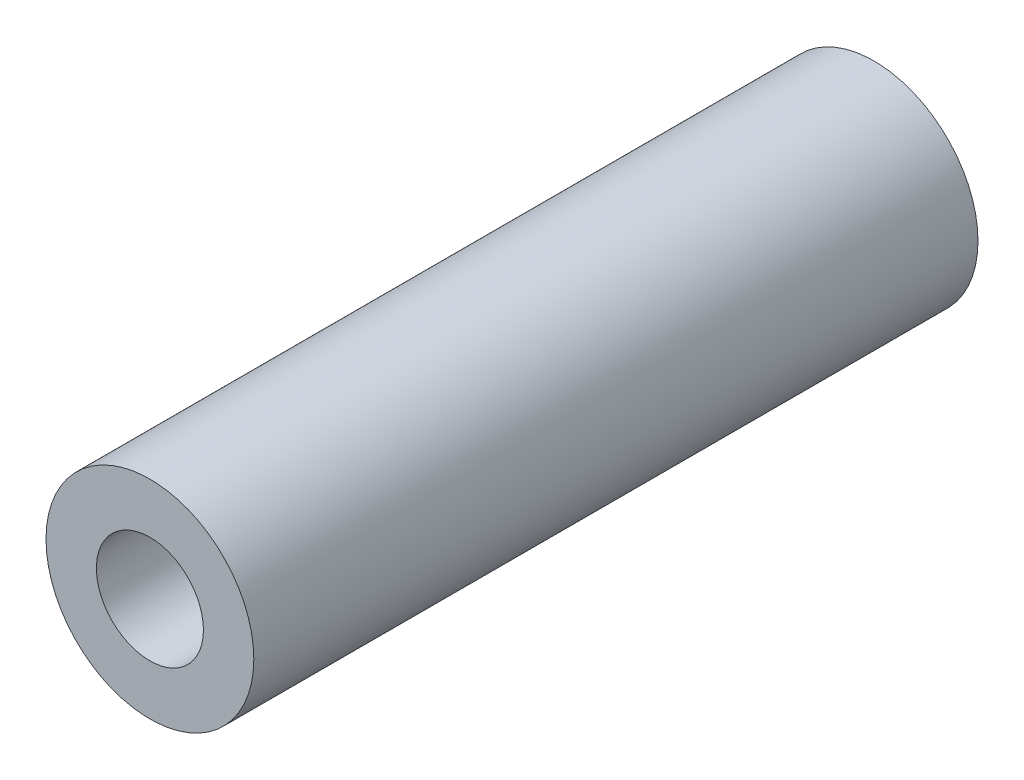
ISO-10303-21;
HEADER;
FILE_DESCRIPTION(('STEP AP214'),'2;1');
FILE_NAME('part.step','',(''),(''),'','','');
FILE_SCHEMA(('AUTOMOTIVE_DESIGN { 1 0 10303 214 1 1 1 1 }'));
ENDSEC;
DATA;
#1=APPLICATION_CONTEXT('core data for automotive mechanical design processes');
#2=APPLICATION_PROTOCOL_DEFINITION('international standard','automotive_design',2000,#1);
#3=PRODUCT_CONTEXT('',#1,'mechanical');
#4=PRODUCT('Part','Part','',(#3));
#5=PRODUCT_RELATED_PRODUCT_CATEGORY('part','',(#4));
#6=PRODUCT_DEFINITION_FORMATION('','',#4);
#7=PRODUCT_DEFINITION_CONTEXT('part definition',#1,'design');
#8=PRODUCT_DEFINITION('design','',#6,#7);
#9=PRODUCT_DEFINITION_SHAPE('','',#8);
#10=(LENGTH_UNIT() NAMED_UNIT(*) SI_UNIT(.MILLI.,.METRE.));
#11=(NAMED_UNIT(*) PLANE_ANGLE_UNIT() SI_UNIT($,.RADIAN.));
#12=(NAMED_UNIT(*) SI_UNIT($,.STERADIAN.) SOLID_ANGLE_UNIT());
#13=UNCERTAINTY_MEASURE_WITH_UNIT(LENGTH_MEASURE(1.E-05),#10,'distance_accuracy_value','');
#14=(GEOMETRIC_REPRESENTATION_CONTEXT(3) GLOBAL_UNCERTAINTY_ASSIGNED_CONTEXT((#13)) GLOBAL_UNIT_ASSIGNED_CONTEXT((#10,
#11,#12)) REPRESENTATION_CONTEXT('',''));
#15=CARTESIAN_POINT('',(0.,0.,0.));
#16=DIRECTION('',(0.,0.,1.));
#17=DIRECTION('',(1.,0.,0.));
#18=AXIS2_PLACEMENT_3D('',#15,#16,#17);
#19=CARTESIAN_POINT('',(0.,0.,23.));
#20=DIRECTION('',(0.,0.,1.));
#21=DIRECTION('',(1.,0.,0.));
#22=AXIS2_PLACEMENT_3D('',#19,#20,#21);
#23=PLANE('',#22);
#24=CARTESIAN_POINT('',(0.,0.,23.));
#25=DIRECTION('',(0.,0.,1.));
#26=DIRECTION('',(1.,0.,0.));
#27=AXIS2_PLACEMENT_3D('',#24,#25,#26);
#28=CIRCLE('',#27,3.3);
#29=CARTESIAN_POINT('',(3.3,0.,23.));
#30=VERTEX_POINT('',#29);
#31=EDGE_CURVE('E10',#30,#30,#28,.T.);
#32=ORIENTED_EDGE('',*,*,#31,.T.);
#33=EDGE_LOOP('',(#32));
#34=FACE_BOUND('',#33,.T.);
#35=CARTESIAN_POINT('',(0.,0.,23.));
#36=DIRECTION('',(0.,0.,1.));
#37=DIRECTION('',(1.,0.,0.));
#38=AXIS2_PLACEMENT_3D('',#35,#36,#37);
#39=CIRCLE('',#38,1.7);
#40=CARTESIAN_POINT('',(1.7,0.,23.));
#41=VERTEX_POINT('',#40);
#42=EDGE_CURVE('E46',#41,#41,#39,.T.);
#43=ORIENTED_EDGE('',*,*,#42,.F.);
#44=EDGE_LOOP('',(#43));
#45=FACE_BOUND('',#44,.T.);
#46=ADVANCED_FACE('F35',(#34,#45),#23,.T.);
#47=CARTESIAN_POINT('',(0.,0.,0.));
#48=DIRECTION('',(0.,0.,1.));
#49=DIRECTION('',(1.,0.,0.));
#50=AXIS2_PLACEMENT_3D('',#47,#48,#49);
#51=PLANE('',#50);
#52=CARTESIAN_POINT('',(0.,0.,0.));
#53=DIRECTION('',(0.,0.,1.));
#54=DIRECTION('',(1.,0.,0.));
#55=AXIS2_PLACEMENT_3D('',#52,#53,#54);
#56=CIRCLE('',#55,3.3);
#57=CARTESIAN_POINT('',(3.3,0.,0.));
#58=VERTEX_POINT('',#57);
#59=EDGE_CURVE('E39',#58,#58,#56,.T.);
#60=ORIENTED_EDGE('',*,*,#59,.F.);
#61=EDGE_LOOP('',(#60));
#62=FACE_BOUND('',#61,.T.);
#63=CARTESIAN_POINT('',(0.,0.,0.));
#64=DIRECTION('',(0.,0.,1.));
#65=DIRECTION('',(1.,0.,0.));
#66=AXIS2_PLACEMENT_3D('',#63,#64,#65);
#67=CIRCLE('',#66,1.7);
#68=CARTESIAN_POINT('',(1.7,0.,0.));
#69=VERTEX_POINT('',#68);
#70=EDGE_CURVE('E48',#69,#69,#67,.T.);
#71=ORIENTED_EDGE('',*,*,#70,.T.);
#72=EDGE_LOOP('',(#71));
#73=FACE_BOUND('',#72,.T.);
#74=ADVANCED_FACE('F58',(#62,#73),#51,.F.);
#75=CARTESIAN_POINT('',(0.,0.,23.));
#76=DIRECTION('',(0.,0.,-1.));
#77=DIRECTION('',(-1.,0.,0.));
#78=AXIS2_PLACEMENT_3D('',#75,#76,#77);
#79=CYLINDRICAL_SURFACE('',#78,3.3);
#80=ORIENTED_EDGE('',*,*,#31,.F.);
#81=EDGE_LOOP('',(#80));
#82=FACE_BOUND('',#81,.T.);
#83=ORIENTED_EDGE('',*,*,#59,.T.);
#84=EDGE_LOOP('',(#83));
#85=FACE_BOUND('',#84,.T.);
#86=ADVANCED_FACE('F37',(#82,#85),#79,.T.);
#87=CARTESIAN_POINT('',(0.,0.,23.));
#88=DIRECTION('',(0.,0.,-1.));
#89=DIRECTION('',(-1.,0.,0.));
#90=AXIS2_PLACEMENT_3D('',#87,#88,#89);
#91=CYLINDRICAL_SURFACE('',#90,1.7);
#92=ORIENTED_EDGE('',*,*,#42,.T.);
#93=EDGE_LOOP('',(#92));
#94=FACE_BOUND('',#93,.T.);
#95=ORIENTED_EDGE('',*,*,#70,.F.);
#96=EDGE_LOOP('',(#95));
#97=FACE_BOUND('',#96,.T.);
#98=ADVANCED_FACE('F54',(#94,#97),#91,.F.);
#99=CLOSED_SHELL('',(#46,#74,#86,#98));
#100=MANIFOLD_SOLID_BREP('B2',#99);
#101=ADVANCED_BREP_SHAPE_REPRESENTATION('',(#18,#100),#14);
#102=SHAPE_DEFINITION_REPRESENTATION(#9,#101);
ENDSEC;
END-ISO-10303-21;
